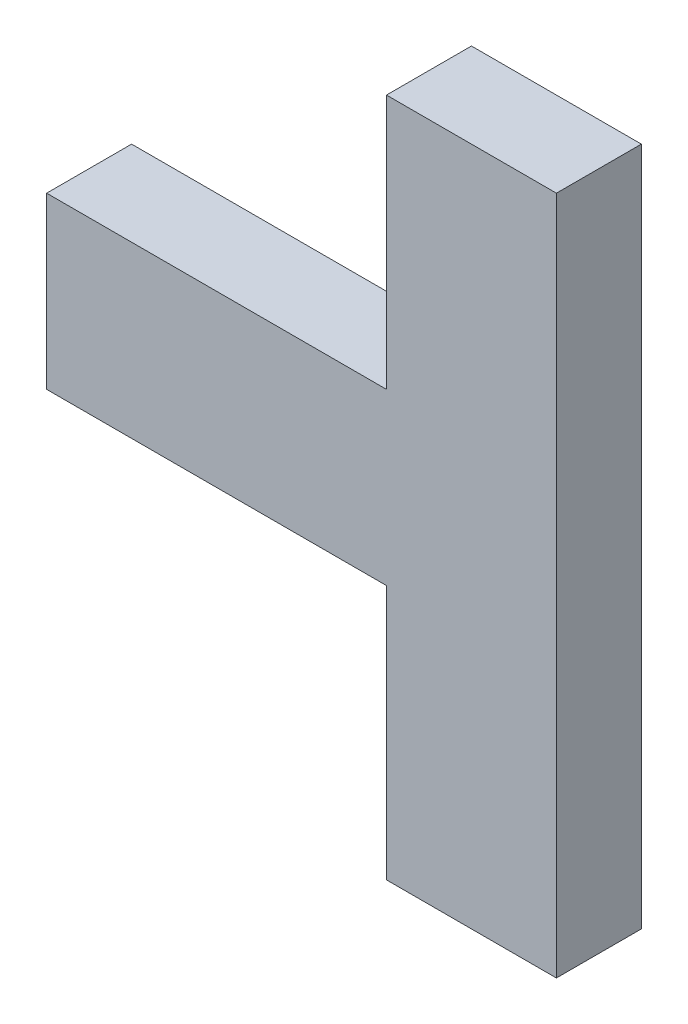
ISO-10303-21;
HEADER;
FILE_DESCRIPTION(('STEP AP214'),'2;1');
FILE_NAME('part.step','',(''),(''),'','','');
FILE_SCHEMA(('AUTOMOTIVE_DESIGN { 1 0 10303 214 1 1 1 1 }'));
ENDSEC;
DATA;
#1=APPLICATION_CONTEXT('core data for automotive mechanical design processes');
#2=APPLICATION_PROTOCOL_DEFINITION('international standard','automotive_design',2000,#1);
#3=PRODUCT_CONTEXT('',#1,'mechanical');
#4=PRODUCT('Part','Part','',(#3));
#5=PRODUCT_RELATED_PRODUCT_CATEGORY('part','',(#4));
#6=PRODUCT_DEFINITION_FORMATION('','',#4);
#7=PRODUCT_DEFINITION_CONTEXT('part definition',#1,'design');
#8=PRODUCT_DEFINITION('design','',#6,#7);
#9=PRODUCT_DEFINITION_SHAPE('','',#8);
#10=(LENGTH_UNIT() NAMED_UNIT(*) SI_UNIT(.MILLI.,.METRE.));
#11=(NAMED_UNIT(*) PLANE_ANGLE_UNIT() SI_UNIT($,.RADIAN.));
#12=(NAMED_UNIT(*) SI_UNIT($,.STERADIAN.) SOLID_ANGLE_UNIT());
#13=UNCERTAINTY_MEASURE_WITH_UNIT(LENGTH_MEASURE(1.E-05),#10,'distance_accuracy_value','');
#14=(GEOMETRIC_REPRESENTATION_CONTEXT(3) GLOBAL_UNCERTAINTY_ASSIGNED_CONTEXT((#13)) GLOBAL_UNIT_ASSIGNED_CONTEXT((#10,
#11,#12)) REPRESENTATION_CONTEXT('',''));
#15=CARTESIAN_POINT('',(0.,0.,0.));
#16=DIRECTION('',(0.,0.,1.));
#17=DIRECTION('',(1.,0.,0.));
#18=AXIS2_PLACEMENT_3D('',#15,#16,#17);
#19=CARTESIAN_POINT('',(0.2999994,-0.3999992,0.0999998));
#20=DIRECTION('',(0.,0.,-1.));
#21=DIRECTION('',(-1.,0.,0.));
#22=AXIS2_PLACEMENT_3D('',#19,#20,#21);
#23=PLANE('',#22);
#24=DIRECTION('',(1.,0.,0.));
#25=VECTOR('',#24,1.);
#26=CARTESIAN_POINT('',(0.2999994,0.3999992,0.0999998));
#27=LINE('',#26,#25);
#28=CARTESIAN_POINT('',(0.2999994,0.3999992,0.0999998));
#29=VERTEX_POINT('',#28);
#30=CARTESIAN_POINT('',(0.0999998,0.3999992,0.0999998));
#31=VERTEX_POINT('',#30);
#32=EDGE_CURVE('E116',#29,#31,#27,.F.);
#33=ORIENTED_EDGE('',*,*,#32,.T.);
#34=DIRECTION('',(0.,1.,0.));
#35=VECTOR('',#34,1.);
#36=CARTESIAN_POINT('',(0.0999998,0.3999992,0.0999998));
#37=LINE('',#36,#35);
#38=CARTESIAN_POINT('',(0.0999998,0.0999998,0.0999998));
#39=VERTEX_POINT('',#38);
#40=EDGE_CURVE('E112',#31,#39,#37,.F.);
#41=ORIENTED_EDGE('',*,*,#40,.T.);
#42=DIRECTION('',(1.,0.,0.));
#43=VECTOR('',#42,1.);
#44=CARTESIAN_POINT('',(0.0999998,0.0999998,0.0999998));
#45=LINE('',#44,#43);
#46=CARTESIAN_POINT('',(-0.2999994,0.0999998,0.0999998));
#47=VERTEX_POINT('',#46);
#48=EDGE_CURVE('E108',#39,#47,#45,.F.);
#49=ORIENTED_EDGE('',*,*,#48,.T.);
#50=DIRECTION('',(0.,1.,0.));
#51=VECTOR('',#50,1.);
#52=CARTESIAN_POINT('',(-0.2999994,0.0999998,0.0999998));
#53=LINE('',#52,#51);
#54=CARTESIAN_POINT('',(-0.2999994,-0.0999998,0.0999998));
#55=VERTEX_POINT('',#54);
#56=EDGE_CURVE('E104',#47,#55,#53,.F.);
#57=ORIENTED_EDGE('',*,*,#56,.T.);
#58=DIRECTION('',(1.,0.,0.));
#59=VECTOR('',#58,1.);
#60=CARTESIAN_POINT('',(-0.2999994,-0.0999998,0.0999998));
#61=LINE('',#60,#59);
#62=CARTESIAN_POINT('',(0.0999998,-0.0999998,0.0999998));
#63=VERTEX_POINT('',#62);
#64=EDGE_CURVE('E80',#55,#63,#61,.T.);
#65=ORIENTED_EDGE('',*,*,#64,.T.);
#66=DIRECTION('',(0.,1.,0.));
#67=VECTOR('',#66,1.);
#68=CARTESIAN_POINT('',(0.0999998,-0.0999998,0.0999998));
#69=LINE('',#68,#67);
#70=CARTESIAN_POINT('',(0.0999998,-0.3999992,0.0999998));
#71=VERTEX_POINT('',#70);
#72=EDGE_CURVE('E82',#63,#71,#69,.F.);
#73=ORIENTED_EDGE('',*,*,#72,.T.);
#74=DIRECTION('',(1.,0.,0.));
#75=VECTOR('',#74,1.);
#76=CARTESIAN_POINT('',(0.0999998,-0.3999992,0.0999998));
#77=LINE('',#76,#75);
#78=CARTESIAN_POINT('',(0.2999994,-0.3999992,0.0999998));
#79=VERTEX_POINT('',#78);
#80=EDGE_CURVE('E20',#71,#79,#77,.T.);
#81=ORIENTED_EDGE('',*,*,#80,.T.);
#82=DIRECTION('',(0.,1.,0.));
#83=VECTOR('',#82,1.);
#84=CARTESIAN_POINT('',(0.2999994,-0.3999992,0.0999998));
#85=LINE('',#84,#83);
#86=EDGE_CURVE('E121',#79,#29,#85,.T.);
#87=ORIENTED_EDGE('',*,*,#86,.T.);
#88=EDGE_LOOP('',(#33,#41,#49,#57,#65,#73,#81,#87));
#89=FACE_BOUND('',#88,.T.);
#90=ADVANCED_FACE('F17',(#89),#23,.F.);
#91=CARTESIAN_POINT('',(0.0999998,-0.3999992,0.));
#92=DIRECTION('',(0.,1.,0.));
#93=DIRECTION('',(0.,0.,1.));
#94=AXIS2_PLACEMENT_3D('',#91,#92,#93);
#95=PLANE('',#94);
#96=DIRECTION('',(0.,0.,1.));
#97=VECTOR('',#96,1.);
#98=CARTESIAN_POINT('',(0.2999994,-0.3999992,0.));
#99=LINE('',#98,#97);
#100=CARTESIAN_POINT('',(0.2999994,-0.3999992,0.));
#101=VERTEX_POINT('',#100);
#102=EDGE_CURVE('E93',#101,#79,#99,.T.);
#103=ORIENTED_EDGE('',*,*,#102,.T.);
#104=ORIENTED_EDGE('',*,*,#80,.F.);
#105=DIRECTION('',(0.,0.,-1.));
#106=VECTOR('',#105,1.);
#107=CARTESIAN_POINT('',(0.0999998,-0.3999992,0.));
#108=LINE('',#107,#106);
#109=CARTESIAN_POINT('',(0.0999998,-0.3999992,0.));
#110=VERTEX_POINT('',#109);
#111=EDGE_CURVE('E88',#71,#110,#108,.T.);
#112=ORIENTED_EDGE('',*,*,#111,.T.);
#113=DIRECTION('',(-1.,0.,0.));
#114=VECTOR('',#113,1.);
#115=CARTESIAN_POINT('',(0.2999994,-0.3999992,0.));
#116=LINE('',#115,#114);
#117=EDGE_CURVE('E124',#101,#110,#116,.T.);
#118=ORIENTED_EDGE('',*,*,#117,.F.);
#119=EDGE_LOOP('',(#103,#104,#112,#118));
#120=FACE_BOUND('',#119,.T.);
#121=ADVANCED_FACE('F90',(#120),#95,.F.);
#122=CARTESIAN_POINT('',(0.0999998,-0.0999998,0.));
#123=DIRECTION('',(1.,0.,0.));
#124=DIRECTION('',(0.,0.,-1.));
#125=AXIS2_PLACEMENT_3D('',#122,#123,#124);
#126=PLANE('',#125);
#127=ORIENTED_EDGE('',*,*,#111,.F.);
#128=ORIENTED_EDGE('',*,*,#72,.F.);
#129=DIRECTION('',(0.,0.,1.));
#130=VECTOR('',#129,1.);
#131=CARTESIAN_POINT('',(0.0999998,-0.0999998,0.));
#132=LINE('',#131,#130);
#133=CARTESIAN_POINT('',(0.0999998,-0.0999998,0.));
#134=VERTEX_POINT('',#133);
#135=EDGE_CURVE('E100',#63,#134,#132,.F.);
#136=ORIENTED_EDGE('',*,*,#135,.T.);
#137=DIRECTION('',(0.,1.,0.));
#138=VECTOR('',#137,1.);
#139=CARTESIAN_POINT('',(0.0999998,-0.3999992,0.));
#140=LINE('',#139,#138);
#141=EDGE_CURVE('E97',#110,#134,#140,.T.);
#142=ORIENTED_EDGE('',*,*,#141,.F.);
#143=EDGE_LOOP('',(#127,#128,#136,#142));
#144=FACE_BOUND('',#143,.T.);
#145=ADVANCED_FACE('F95',(#144),#126,.F.);
#146=CARTESIAN_POINT('',(-0.2999994,-0.0999998,0.));
#147=DIRECTION('',(0.,1.,0.));
#148=DIRECTION('',(0.,0.,1.));
#149=AXIS2_PLACEMENT_3D('',#146,#147,#148);
#150=PLANE('',#149);
#151=ORIENTED_EDGE('',*,*,#135,.F.);
#152=ORIENTED_EDGE('',*,*,#64,.F.);
#153=DIRECTION('',(0.,0.,-1.));
#154=VECTOR('',#153,1.);
#155=CARTESIAN_POINT('',(-0.2999994,-0.0999998,0.));
#156=LINE('',#155,#154);
#157=CARTESIAN_POINT('',(-0.2999994,-0.0999998,0.));
#158=VERTEX_POINT('',#157);
#159=EDGE_CURVE('E106',#55,#158,#156,.T.);
#160=ORIENTED_EDGE('',*,*,#159,.T.);
#161=DIRECTION('',(-1.,0.,0.));
#162=VECTOR('',#161,1.);
#163=CARTESIAN_POINT('',(0.2999994,-0.0999998,0.));
#164=LINE('',#163,#162);
#165=EDGE_CURVE('E127',#134,#158,#164,.T.);
#166=ORIENTED_EDGE('',*,*,#165,.F.);
#167=EDGE_LOOP('',(#151,#152,#160,#166));
#168=FACE_BOUND('',#167,.T.);
#169=ADVANCED_FACE('F160',(#168),#150,.F.);
#170=CARTESIAN_POINT('',(-0.2999994,0.0999998,0.));
#171=DIRECTION('',(1.,0.,0.));
#172=DIRECTION('',(0.,0.,-1.));
#173=AXIS2_PLACEMENT_3D('',#170,#171,#172);
#174=PLANE('',#173);
#175=ORIENTED_EDGE('',*,*,#159,.F.);
#176=ORIENTED_EDGE('',*,*,#56,.F.);
#177=DIRECTION('',(0.,0.,-1.));
#178=VECTOR('',#177,1.);
#179=CARTESIAN_POINT('',(-0.2999994,0.0999998,0.));
#180=LINE('',#179,#178);
#181=CARTESIAN_POINT('',(-0.2999994,0.0999998,0.));
#182=VERTEX_POINT('',#181);
#183=EDGE_CURVE('E110',#47,#182,#180,.T.);
#184=ORIENTED_EDGE('',*,*,#183,.T.);
#185=DIRECTION('',(0.,1.,0.));
#186=VECTOR('',#185,1.);
#187=CARTESIAN_POINT('',(-0.2999994,-0.3999992,0.));
#188=LINE('',#187,#186);
#189=EDGE_CURVE('E130',#158,#182,#188,.T.);
#190=ORIENTED_EDGE('',*,*,#189,.F.);
#191=EDGE_LOOP('',(#175,#176,#184,#190));
#192=FACE_BOUND('',#191,.T.);
#193=ADVANCED_FACE('F158',(#192),#174,.F.);
#194=CARTESIAN_POINT('',(0.0999998,0.0999998,0.));
#195=DIRECTION('',(0.,-1.,0.));
#196=DIRECTION('',(0.,0.,-1.));
#197=AXIS2_PLACEMENT_3D('',#194,#195,#196);
#198=PLANE('',#197);
#199=ORIENTED_EDGE('',*,*,#183,.F.);
#200=ORIENTED_EDGE('',*,*,#48,.F.);
#201=DIRECTION('',(0.,0.,-1.));
#202=VECTOR('',#201,1.);
#203=CARTESIAN_POINT('',(0.0999998,0.0999998,0.));
#204=LINE('',#203,#202);
#205=CARTESIAN_POINT('',(0.0999998,0.0999998,0.));
#206=VERTEX_POINT('',#205);
#207=EDGE_CURVE('E114',#39,#206,#204,.T.);
#208=ORIENTED_EDGE('',*,*,#207,.T.);
#209=DIRECTION('',(-1.,0.,0.));
#210=VECTOR('',#209,1.);
#211=CARTESIAN_POINT('',(0.2999994,0.0999998,0.));
#212=LINE('',#211,#210);
#213=EDGE_CURVE('E133',#182,#206,#212,.F.);
#214=ORIENTED_EDGE('',*,*,#213,.F.);
#215=EDGE_LOOP('',(#199,#200,#208,#214));
#216=FACE_BOUND('',#215,.T.);
#217=ADVANCED_FACE('F153',(#216),#198,.F.);
#218=CARTESIAN_POINT('',(0.0999998,0.3999992,0.));
#219=DIRECTION('',(1.,0.,0.));
#220=DIRECTION('',(0.,0.,-1.));
#221=AXIS2_PLACEMENT_3D('',#218,#219,#220);
#222=PLANE('',#221);
#223=ORIENTED_EDGE('',*,*,#207,.F.);
#224=ORIENTED_EDGE('',*,*,#40,.F.);
#225=DIRECTION('',(0.,0.,-1.));
#226=VECTOR('',#225,1.);
#227=CARTESIAN_POINT('',(0.0999998,0.3999992,0.));
#228=LINE('',#227,#226);
#229=CARTESIAN_POINT('',(0.0999998,0.3999992,0.));
#230=VERTEX_POINT('',#229);
#231=EDGE_CURVE('E118',#31,#230,#228,.T.);
#232=ORIENTED_EDGE('',*,*,#231,.T.);
#233=DIRECTION('',(0.,1.,0.));
#234=VECTOR('',#233,1.);
#235=CARTESIAN_POINT('',(0.0999998,-0.3999992,0.));
#236=LINE('',#235,#234);
#237=EDGE_CURVE('E136',#206,#230,#236,.T.);
#238=ORIENTED_EDGE('',*,*,#237,.F.);
#239=EDGE_LOOP('',(#223,#224,#232,#238));
#240=FACE_BOUND('',#239,.T.);
#241=ADVANCED_FACE('F148',(#240),#222,.F.);
#242=CARTESIAN_POINT('',(0.2999994,0.3999992,0.));
#243=DIRECTION('',(0.,-1.,0.));
#244=DIRECTION('',(0.,0.,-1.));
#245=AXIS2_PLACEMENT_3D('',#242,#243,#244);
#246=PLANE('',#245);
#247=ORIENTED_EDGE('',*,*,#231,.F.);
#248=ORIENTED_EDGE('',*,*,#32,.F.);
#249=DIRECTION('',(0.,0.,1.));
#250=VECTOR('',#249,1.);
#251=CARTESIAN_POINT('',(0.2999994,0.3999992,0.));
#252=LINE('',#251,#250);
#253=CARTESIAN_POINT('',(0.2999994,0.3999992,0.));
#254=VERTEX_POINT('',#253);
#255=EDGE_CURVE('E35',#29,#254,#252,.F.);
#256=ORIENTED_EDGE('',*,*,#255,.T.);
#257=DIRECTION('',(-1.,0.,0.));
#258=VECTOR('',#257,1.);
#259=CARTESIAN_POINT('',(0.2999994,0.3999992,0.));
#260=LINE('',#259,#258);
#261=EDGE_CURVE('E26',#230,#254,#260,.F.);
#262=ORIENTED_EDGE('',*,*,#261,.F.);
#263=EDGE_LOOP('',(#247,#248,#256,#262));
#264=FACE_BOUND('',#263,.T.);
#265=ADVANCED_FACE('F144',(#264),#246,.F.);
#266=CARTESIAN_POINT('',(0.2999994,-0.3999992,0.));
#267=DIRECTION('',(-1.,0.,0.));
#268=DIRECTION('',(0.,0.,1.));
#269=AXIS2_PLACEMENT_3D('',#266,#267,#268);
#270=PLANE('',#269);
#271=ORIENTED_EDGE('',*,*,#255,.F.);
#272=ORIENTED_EDGE('',*,*,#86,.F.);
#273=ORIENTED_EDGE('',*,*,#102,.F.);
#274=DIRECTION('',(0.,1.,0.));
#275=VECTOR('',#274,1.);
#276=CARTESIAN_POINT('',(0.2999994,-0.3999992,0.));
#277=LINE('',#276,#275);
#278=EDGE_CURVE('E11',#254,#101,#277,.F.);
#279=ORIENTED_EDGE('',*,*,#278,.F.);
#280=EDGE_LOOP('',(#271,#272,#273,#279));
#281=FACE_BOUND('',#280,.T.);
#282=ADVANCED_FACE('F163',(#281),#270,.F.);
#283=CARTESIAN_POINT('',(0.2999994,-0.3999992,0.));
#284=DIRECTION('',(0.,0.,-1.));
#285=DIRECTION('',(-1.,0.,0.));
#286=AXIS2_PLACEMENT_3D('',#283,#284,#285);
#287=PLANE('',#286);
#288=ORIENTED_EDGE('',*,*,#261,.T.);
#289=ORIENTED_EDGE('',*,*,#278,.T.);
#290=ORIENTED_EDGE('',*,*,#117,.T.);
#291=ORIENTED_EDGE('',*,*,#141,.T.);
#292=ORIENTED_EDGE('',*,*,#165,.T.);
#293=ORIENTED_EDGE('',*,*,#189,.T.);
#294=ORIENTED_EDGE('',*,*,#213,.T.);
#295=ORIENTED_EDGE('',*,*,#237,.T.);
#296=EDGE_LOOP('',(#288,#289,#290,#291,#292,#293,#294,#295));
#297=FACE_BOUND('',#296,.T.);
#298=ADVANCED_FACE('F141',(#297),#287,.T.);
#299=CLOSED_SHELL('',(#90,#121,#145,#169,#193,#217,#241,#265,#282,#298));
#300=MANIFOLD_SOLID_BREP('B1',#299);
#301=ADVANCED_BREP_SHAPE_REPRESENTATION('',(#18,#300),#14);
#302=SHAPE_DEFINITION_REPRESENTATION(#9,#301);
ENDSEC;
END-ISO-10303-21;
